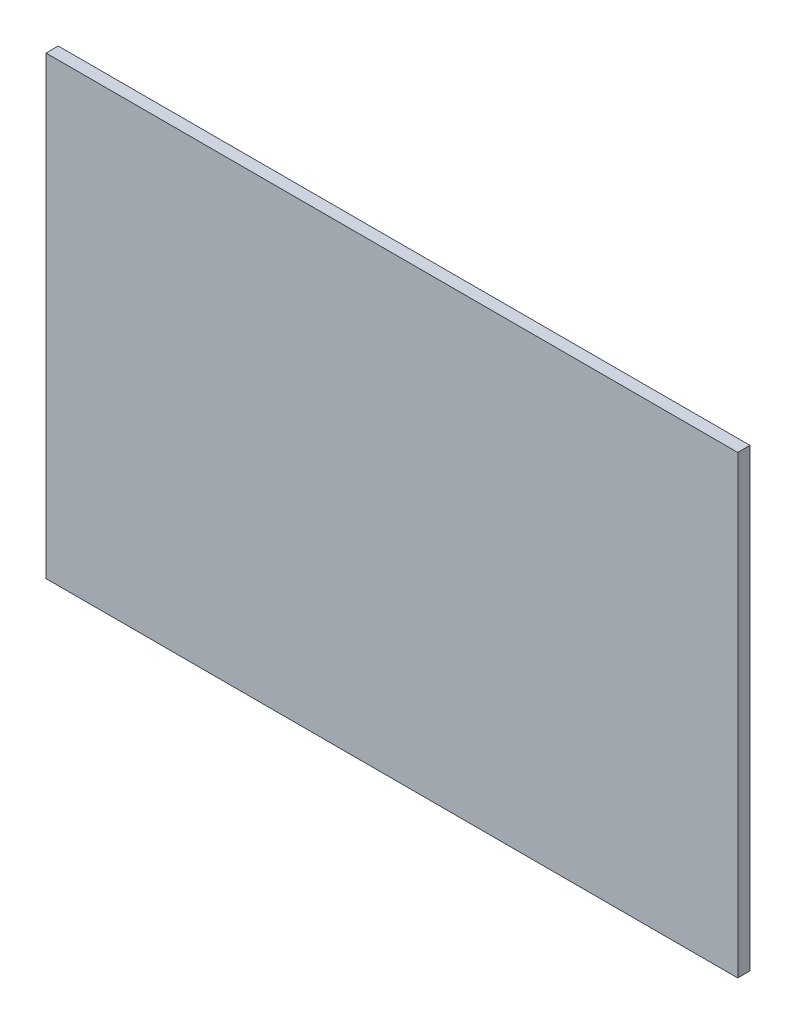
ISO-10303-21;
HEADER;
FILE_DESCRIPTION(('STEP AP214'),'2;1');
FILE_NAME('part.step','',(''),(''),'','','');
FILE_SCHEMA(('AUTOMOTIVE_DESIGN { 1 0 10303 214 1 1 1 1 }'));
ENDSEC;
DATA;
#1=APPLICATION_CONTEXT('core data for automotive mechanical design processes');
#2=APPLICATION_PROTOCOL_DEFINITION('international standard','automotive_design',2000,#1);
#3=PRODUCT_CONTEXT('',#1,'mechanical');
#4=PRODUCT('Part','Part','',(#3));
#5=PRODUCT_RELATED_PRODUCT_CATEGORY('part','',(#4));
#6=PRODUCT_DEFINITION_FORMATION('','',#4);
#7=PRODUCT_DEFINITION_CONTEXT('part definition',#1,'design');
#8=PRODUCT_DEFINITION('design','',#6,#7);
#9=PRODUCT_DEFINITION_SHAPE('','',#8);
#10=(LENGTH_UNIT() NAMED_UNIT(*) SI_UNIT(.MILLI.,.METRE.));
#11=(NAMED_UNIT(*) PLANE_ANGLE_UNIT() SI_UNIT($,.RADIAN.));
#12=(NAMED_UNIT(*) SI_UNIT($,.STERADIAN.) SOLID_ANGLE_UNIT());
#13=UNCERTAINTY_MEASURE_WITH_UNIT(LENGTH_MEASURE(1.E-05),#10,'distance_accuracy_value','');
#14=(GEOMETRIC_REPRESENTATION_CONTEXT(3) GLOBAL_UNCERTAINTY_ASSIGNED_CONTEXT((#13)) GLOBAL_UNIT_ASSIGNED_CONTEXT((#10,
#11,#12)) REPRESENTATION_CONTEXT('',''));
#15=CARTESIAN_POINT('',(0.,0.,0.));
#16=DIRECTION('',(0.,0.,1.));
#17=DIRECTION('',(1.,0.,0.));
#18=AXIS2_PLACEMENT_3D('',#15,#16,#17);
#19=CARTESIAN_POINT('',(-19.9999999999999,25.8895406963625,-3.));
#20=DIRECTION('',(1.,0.,0.));
#21=DIRECTION('',(0.,1.,0.));
#22=AXIS2_PLACEMENT_3D('',#19,#20,#21);
#23=PLANE('',#22);
#24=DIRECTION('',(0.,-1.,0.));
#25=VECTOR('',#24,1.);
#26=CARTESIAN_POINT('',(-19.9999999999999,25.8895406963625,0.));
#27=LINE('',#26,#25);
#28=CARTESIAN_POINT('',(-19.9999999999999,25.8895406963625,0.));
#29=VERTEX_POINT('',#28);
#30=CARTESIAN_POINT('',(-19.9999999999999,-85.9787968324071,0.));
#31=VERTEX_POINT('',#30);
#32=EDGE_CURVE('E98',#29,#31,#27,.T.);
#33=ORIENTED_EDGE('',*,*,#32,.F.);
#34=DIRECTION('',(0.,0.,1.));
#35=VECTOR('',#34,1.);
#36=CARTESIAN_POINT('',(-19.9999999999999,25.8895406963625,-3.));
#37=LINE('',#36,#35);
#38=CARTESIAN_POINT('',(-19.9999999999999,25.8895406963625,-3.));
#39=VERTEX_POINT('',#38);
#40=EDGE_CURVE('E97',#39,#29,#37,.T.);
#41=ORIENTED_EDGE('',*,*,#40,.F.);
#42=DIRECTION('',(0.,-1.,0.));
#43=VECTOR('',#42,1.);
#44=CARTESIAN_POINT('',(-19.9999999999999,25.8895406963625,-3.));
#45=LINE('',#44,#43);
#46=CARTESIAN_POINT('',(-19.9999999999999,-85.9787968324071,-3.));
#47=VERTEX_POINT('',#46);
#48=EDGE_CURVE('E92',#39,#47,#45,.T.);
#49=ORIENTED_EDGE('',*,*,#48,.T.);
#50=DIRECTION('',(0.,0.,1.));
#51=VECTOR('',#50,1.);
#52=CARTESIAN_POINT('',(-19.9999999999999,-85.9787968324071,-3.));
#53=LINE('',#52,#51);
#54=EDGE_CURVE('E11',#47,#31,#53,.T.);
#55=ORIENTED_EDGE('',*,*,#54,.T.);
#56=EDGE_LOOP('',(#33,#41,#49,#55));
#57=FACE_BOUND('',#56,.T.);
#58=ADVANCED_FACE('F35',(#57),#23,.F.);
#59=CARTESIAN_POINT('',(-19.9999999999999,-85.9787968324071,-3.));
#60=DIRECTION('',(0.,1.,0.));
#61=DIRECTION('',(0.,0.,-1.));
#62=AXIS2_PLACEMENT_3D('',#59,#60,#61);
#63=PLANE('',#62);
#64=DIRECTION('',(1.,0.,0.));
#65=VECTOR('',#64,1.);
#66=CARTESIAN_POINT('',(-19.9999999999999,-85.9787968324071,0.));
#67=LINE('',#66,#65);
#68=CARTESIAN_POINT('',(150.,-85.9787968324071,0.));
#69=VERTEX_POINT('',#68);
#70=EDGE_CURVE('E100',#31,#69,#67,.T.);
#71=ORIENTED_EDGE('',*,*,#70,.F.);
#72=ORIENTED_EDGE('',*,*,#54,.F.);
#73=DIRECTION('',(1.,0.,0.));
#74=VECTOR('',#73,1.);
#75=CARTESIAN_POINT('',(-19.9999999999999,-85.9787968324071,-3.));
#76=LINE('',#75,#74);
#77=CARTESIAN_POINT('',(150.,-85.9787968324071,-3.));
#78=VERTEX_POINT('',#77);
#79=EDGE_CURVE('E76',#47,#78,#76,.T.);
#80=ORIENTED_EDGE('',*,*,#79,.T.);
#81=DIRECTION('',(0.,0.,1.));
#82=VECTOR('',#81,1.);
#83=CARTESIAN_POINT('',(150.,-85.9787968324071,-3.));
#84=LINE('',#83,#82);
#85=EDGE_CURVE('E43',#78,#69,#84,.T.);
#86=ORIENTED_EDGE('',*,*,#85,.T.);
#87=EDGE_LOOP('',(#71,#72,#80,#86));
#88=FACE_BOUND('',#87,.T.);
#89=ADVANCED_FACE('F90',(#88),#63,.F.);
#90=CARTESIAN_POINT('',(150.,25.8895406963625,-3.));
#91=DIRECTION('',(-1.,0.,0.));
#92=DIRECTION('',(0.,0.,-1.));
#93=AXIS2_PLACEMENT_3D('',#90,#91,#92);
#94=PLANE('',#93);
#95=DIRECTION('',(0.,1.,0.));
#96=VECTOR('',#95,1.);
#97=CARTESIAN_POINT('',(150.,25.8895406963625,0.));
#98=LINE('',#97,#96);
#99=CARTESIAN_POINT('',(150.,25.8895406963625,0.));
#100=VERTEX_POINT('',#99);
#101=EDGE_CURVE('E86',#69,#100,#98,.T.);
#102=ORIENTED_EDGE('',*,*,#101,.F.);
#103=ORIENTED_EDGE('',*,*,#85,.F.);
#104=DIRECTION('',(0.,1.,0.));
#105=VECTOR('',#104,1.);
#106=CARTESIAN_POINT('',(150.,25.8895406963625,-3.));
#107=LINE('',#106,#105);
#108=CARTESIAN_POINT('',(150.,25.8895406963625,-3.));
#109=VERTEX_POINT('',#108);
#110=EDGE_CURVE('E79',#78,#109,#107,.T.);
#111=ORIENTED_EDGE('',*,*,#110,.T.);
#112=DIRECTION('',(0.,0.,1.));
#113=VECTOR('',#112,1.);
#114=CARTESIAN_POINT('',(150.,25.8895406963625,-3.));
#115=LINE('',#114,#113);
#116=EDGE_CURVE('E89',#109,#100,#115,.T.);
#117=ORIENTED_EDGE('',*,*,#116,.T.);
#118=EDGE_LOOP('',(#102,#103,#111,#117));
#119=FACE_BOUND('',#118,.T.);
#120=ADVANCED_FACE('F85',(#119),#94,.F.);
#121=CARTESIAN_POINT('',(-19.9999999999999,25.8895406963625,-3.));
#122=DIRECTION('',(0.,-1.,0.));
#123=DIRECTION('',(0.,0.,1.));
#124=AXIS2_PLACEMENT_3D('',#121,#122,#123);
#125=PLANE('',#124);
#126=DIRECTION('',(-1.,0.,0.));
#127=VECTOR('',#126,1.);
#128=CARTESIAN_POINT('',(-19.9999999999999,25.8895406963625,0.));
#129=LINE('',#128,#127);
#130=EDGE_CURVE('E65',#100,#29,#129,.T.);
#131=ORIENTED_EDGE('',*,*,#130,.F.);
#132=ORIENTED_EDGE('',*,*,#116,.F.);
#133=DIRECTION('',(-1.,0.,0.));
#134=VECTOR('',#133,1.);
#135=CARTESIAN_POINT('',(-19.9999999999999,25.8895406963625,-3.));
#136=LINE('',#135,#134);
#137=EDGE_CURVE('E51',#109,#39,#136,.T.);
#138=ORIENTED_EDGE('',*,*,#137,.T.);
#139=ORIENTED_EDGE('',*,*,#40,.T.);
#140=EDGE_LOOP('',(#131,#132,#138,#139));
#141=FACE_BOUND('',#140,.T.);
#142=ADVANCED_FACE('F109',(#141),#125,.F.);
#143=CARTESIAN_POINT('',(0.,0.,-3.));
#144=DIRECTION('',(0.,0.,-1.));
#145=DIRECTION('',(1.,0.,0.));
#146=AXIS2_PLACEMENT_3D('',#143,#144,#145);
#147=PLANE('',#146);
#148=ORIENTED_EDGE('',*,*,#48,.F.);
#149=ORIENTED_EDGE('',*,*,#137,.F.);
#150=ORIENTED_EDGE('',*,*,#110,.F.);
#151=ORIENTED_EDGE('',*,*,#79,.F.);
#152=EDGE_LOOP('',(#148,#149,#150,#151));
#153=FACE_BOUND('',#152,.T.);
#154=ADVANCED_FACE('F81',(#153),#147,.T.);
#155=CARTESIAN_POINT('',(0.,0.,0.));
#156=DIRECTION('',(0.,0.,-1.));
#157=DIRECTION('',(1.,0.,0.));
#158=AXIS2_PLACEMENT_3D('',#155,#156,#157);
#159=PLANE('',#158);
#160=ORIENTED_EDGE('',*,*,#32,.T.);
#161=ORIENTED_EDGE('',*,*,#70,.T.);
#162=ORIENTED_EDGE('',*,*,#101,.T.);
#163=ORIENTED_EDGE('',*,*,#130,.T.);
#164=EDGE_LOOP('',(#160,#161,#162,#163));
#165=FACE_BOUND('',#164,.T.);
#166=ADVANCED_FACE('F105',(#165),#159,.F.);
#167=CLOSED_SHELL('',(#58,#89,#120,#142,#154,#166));
#168=MANIFOLD_SOLID_BREP('B2',#167);
#169=ADVANCED_BREP_SHAPE_REPRESENTATION('',(#18,#168),#14);
#170=SHAPE_DEFINITION_REPRESENTATION(#9,#169);
ENDSEC;
END-ISO-10303-21;
